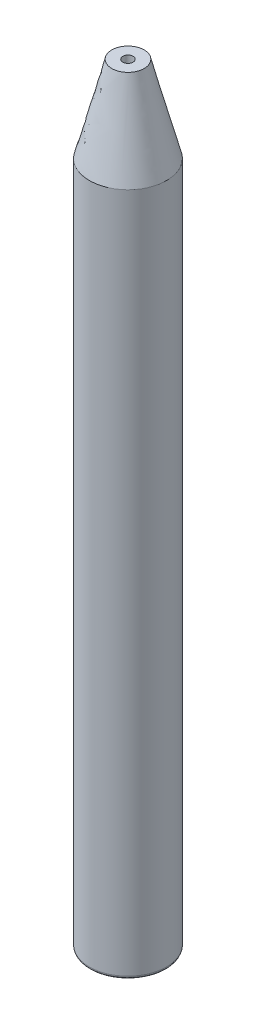
ISO-10303-21;
HEADER;
FILE_DESCRIPTION(('STEP AP214'),'2;1');
FILE_NAME('part.step','',(''),(''),'','','');
FILE_SCHEMA(('AUTOMOTIVE_DESIGN { 1 0 10303 214 1 1 1 1 }'));
ENDSEC;
DATA;
#1=APPLICATION_CONTEXT('core data for automotive mechanical design processes');
#2=APPLICATION_PROTOCOL_DEFINITION('international standard','automotive_design',2000,#1);
#3=PRODUCT_CONTEXT('',#1,'mechanical');
#4=PRODUCT('Part','Part','',(#3));
#5=PRODUCT_RELATED_PRODUCT_CATEGORY('part','',(#4));
#6=PRODUCT_DEFINITION_FORMATION('','',#4);
#7=PRODUCT_DEFINITION_CONTEXT('part definition',#1,'design');
#8=PRODUCT_DEFINITION('design','',#6,#7);
#9=PRODUCT_DEFINITION_SHAPE('','',#8);
#10=(LENGTH_UNIT() NAMED_UNIT(*) SI_UNIT(.MILLI.,.METRE.));
#11=(NAMED_UNIT(*) PLANE_ANGLE_UNIT() SI_UNIT($,.RADIAN.));
#12=(NAMED_UNIT(*) SI_UNIT($,.STERADIAN.) SOLID_ANGLE_UNIT());
#13=UNCERTAINTY_MEASURE_WITH_UNIT(LENGTH_MEASURE(1.E-05),#10,'distance_accuracy_value','');
#14=(GEOMETRIC_REPRESENTATION_CONTEXT(3) GLOBAL_UNCERTAINTY_ASSIGNED_CONTEXT((#13)) GLOBAL_UNIT_ASSIGNED_CONTEXT((#10,
#11,#12)) REPRESENTATION_CONTEXT('',''));
#15=CARTESIAN_POINT('',(0.,0.,0.));
#16=DIRECTION('',(0.,0.,1.));
#17=DIRECTION('',(1.,0.,0.));
#18=AXIS2_PLACEMENT_3D('',#15,#16,#17);
#19=CARTESIAN_POINT('',(0.,67.7,0.));
#20=DIRECTION('',(0.,-1.,0.));
#21=DIRECTION('',(0.,0.,-1.));
#22=AXIS2_PLACEMENT_3D('',#19,#20,#21);
#23=CYLINDRICAL_SURFACE('',#22,3.81);
#24=CARTESIAN_POINT('',(0.,0.299999999999995,0.));
#25=DIRECTION('',(0.,1.,0.));
#26=DIRECTION('',(0.,0.,1.));
#27=AXIS2_PLACEMENT_3D('',#24,#25,#26);
#28=CIRCLE('',#27,3.81);
#29=CARTESIAN_POINT('',(0.,0.299999999999995,3.81));
#30=VERTEX_POINT('',#29);
#31=EDGE_CURVE('E41',#30,#30,#28,.T.);
#32=ORIENTED_EDGE('',*,*,#31,.T.);
#33=EDGE_LOOP('',(#32));
#34=FACE_BOUND('',#33,.T.);
#35=CARTESIAN_POINT('',(0.,67.7,0.));
#36=DIRECTION('',(0.,-1.,0.));
#37=DIRECTION('',(0.,0.,-1.));
#38=AXIS2_PLACEMENT_3D('',#35,#36,#37);
#39=CIRCLE('',#38,3.81);
#40=CARTESIAN_POINT('',(2.3181147054244,67.7,3.02364750136241));
#41=VERTEX_POINT('',#40);
#42=EDGE_CURVE('E45',#41,#41,#39,.F.);
#43=ORIENTED_EDGE('',*,*,#42,.F.);
#44=EDGE_LOOP('',(#43));
#45=FACE_BOUND('',#44,.T.);
#46=ADVANCED_FACE('F34',(#34,#45),#23,.T.);
#47=CARTESIAN_POINT('',(0.,0.,0.));
#48=DIRECTION('',(0.,1.,0.));
#49=DIRECTION('',(0.,0.,1.));
#50=AXIS2_PLACEMENT_3D('',#47,#48,#49);
#51=PLANE('',#50);
#52=CARTESIAN_POINT('',(0.,0.,0.));
#53=DIRECTION('',(0.,1.,0.));
#54=DIRECTION('',(0.,0.,1.));
#55=AXIS2_PLACEMENT_3D('',#52,#53,#54);
#56=CIRCLE('',#55,3.51);
#57=CARTESIAN_POINT('',(0.,0.,3.51));
#58=VERTEX_POINT('',#57);
#59=EDGE_CURVE('E11',#58,#58,#56,.F.);
#60=ORIENTED_EDGE('',*,*,#59,.T.);
#61=EDGE_LOOP('',(#60));
#62=FACE_BOUND('',#61,.T.);
#63=CARTESIAN_POINT('',(0.,0.,0.));
#64=DIRECTION('',(0.,-1.,0.));
#65=DIRECTION('',(0.,0.,-1.));
#66=AXIS2_PLACEMENT_3D('',#63,#64,#65);
#67=CIRCLE('',#66,2.61);
#68=CARTESIAN_POINT('',(0.,0.,-2.61));
#69=VERTEX_POINT('',#68);
#70=EDGE_CURVE('E56',#69,#69,#67,.T.);
#71=ORIENTED_EDGE('',*,*,#70,.F.);
#72=EDGE_LOOP('',(#71));
#73=FACE_BOUND('',#72,.T.);
#74=ADVANCED_FACE('F79',(#62,#73),#51,.F.);
#75=CARTESIAN_POINT('',(0.,76.2,0.));
#76=DIRECTION('',(0.,1.,0.));
#77=DIRECTION('',(0.,0.,1.));
#78=AXIS2_PLACEMENT_3D('',#75,#76,#77);
#79=PLANE('',#78);
#80=CARTESIAN_POINT('',(0.,76.2,0.));
#81=DIRECTION('',(0.,1.,0.));
#82=DIRECTION('',(0.,0.,1.));
#83=AXIS2_PLACEMENT_3D('',#80,#81,#82);
#84=CIRCLE('',#83,0.508);
#85=CARTESIAN_POINT('',(0.,76.2,0.508));
#86=VERTEX_POINT('',#85);
#87=EDGE_CURVE('E55',#86,#86,#84,.T.);
#88=ORIENTED_EDGE('',*,*,#87,.F.);
#89=EDGE_LOOP('',(#88));
#90=FACE_BOUND('',#89,.T.);
#91=CARTESIAN_POINT('',(0.,76.2,0.));
#92=DIRECTION('',(0.,1.,0.));
#93=DIRECTION('',(0.,0.,1.));
#94=AXIS2_PLACEMENT_3D('',#91,#92,#93);
#95=CIRCLE('',#94,1.6);
#96=CARTESIAN_POINT('',(1.21597055390655,76.2,1.03991134816012));
#97=VERTEX_POINT('',#96);
#98=EDGE_CURVE('E49',#97,#97,#95,.T.);
#99=ORIENTED_EDGE('',*,*,#98,.T.);
#100=EDGE_LOOP('',(#99));
#101=FACE_BOUND('',#100,.T.);
#102=ADVANCED_FACE('F68',(#90,#101),#79,.T.);
#103=CARTESIAN_POINT('',(1.21597055390655,76.2,1.03991134816012));
#104=CARTESIAN_POINT('',(2.3181147054244,67.7,3.02364750136241));
#105=CARTESIAN_POINT('',(-0.863852142413691,76.2,3.47185245597322));
#106=CARTESIAN_POINT('',(-3.72918029730043,67.7,7.65987691221121));
#107=CARTESIAN_POINT('',(-3.29579325022679,76.2,1.39202975965298));
#108=CARTESIAN_POINT('',(-8.36540970814922,67.7,1.61258190948638));
#109=CARTESIAN_POINT('',(-1.21597055390655,76.2,-1.03991134816012));
#110=CARTESIAN_POINT('',(-2.3181147054244,67.7,-3.02364750136241));
#111=CARTESIAN_POINT('',(0.863852142413692,76.2,-3.47185245597322));
#112=CARTESIAN_POINT('',(3.72918029730043,67.7,-7.65987691221121));
#113=CARTESIAN_POINT('',(3.29579325022679,76.2,-1.39202975965298));
#114=CARTESIAN_POINT('',(8.36540970814922,67.7,-1.61258190948638));
#115=CARTESIAN_POINT('',(1.21597055390655,76.2,1.03991134816012));
#116=CARTESIAN_POINT('',(2.3181147054244,67.7,3.02364750136241));
#117=(BOUNDED_SURFACE() B_SPLINE_SURFACE(3,1,((#103,#104),(#105,#106),(#107,#108),(#109,#110),
(#111,#112),(#113,#114),(#115,#116)),.UNSPECIFIED.,.T.,.F.,.F.) B_SPLINE_SURFACE_WITH_KNOTS((4,
3,4),(2,2),(0.,0.5,1.),(0.,1.),
.UNSPECIFIED.) GEOMETRIC_REPRESENTATION_ITEM() RATIONAL_B_SPLINE_SURFACE(((1.,1.),
(0.333333333333333,0.333333333333333),(0.333333333333333,0.333333333333333),(1.,1.),
(0.333333333333333,0.333333333333333),(0.333333333333333,0.333333333333333),(1.,1.))) REPRESENTATION_ITEM('') SURFACE());
#118=CARTESIAN_POINT('',(1.21597055390655,76.2,1.03991134816012));
#119=CARTESIAN_POINT('',(1.22745122215153,76.1114583333333,1.06057526642264));
#120=CARTESIAN_POINT('',(1.2389318903965,76.0229166666667,1.08123918468517));
#121=CARTESIAN_POINT('',(1.26189322688646,75.8458333333333,1.12256702121022));
#122=CARTESIAN_POINT('',(1.27337389513144,75.7572916666667,1.14323093947274));
#123=CARTESIAN_POINT('',(1.29633523162139,75.5802083333333,1.18455877599779));
#124=CARTESIAN_POINT('',(1.30781589986637,75.4916666666667,1.20522269426031));
#125=CARTESIAN_POINT('',(1.33077723635633,75.3145833333333,1.24655053078536));
#126=CARTESIAN_POINT('',(1.3422579046013,75.2260416666667,1.26721444904788));
#127=CARTESIAN_POINT('',(1.36521924109126,75.0489583333333,1.30854228557293));
#128=CARTESIAN_POINT('',(1.37669990933624,74.9604166666667,1.32920620383545));
#129=CARTESIAN_POINT('',(1.39966124582619,74.7833333333333,1.3705340403605));
#130=CARTESIAN_POINT('',(1.41114191407117,74.6947916666667,1.39119795862303));
#131=CARTESIAN_POINT('',(1.43410325056112,74.5177083333333,1.43252579514807));
#132=CARTESIAN_POINT('',(1.4455839188061,74.4291666666667,1.4531897134106));
#133=CARTESIAN_POINT('',(1.46854525529606,74.2520833333333,1.49451754993565));
#134=CARTESIAN_POINT('',(1.48002592354103,74.1635416666667,1.51518146819817));
#135=CARTESIAN_POINT('',(1.50298726003099,73.9864583333333,1.55650930472322));
#136=CARTESIAN_POINT('',(1.51446792827597,73.8979166666667,1.57717322298574));
#137=CARTESIAN_POINT('',(1.53742926476592,73.7208333333333,1.61850105951079));
#138=CARTESIAN_POINT('',(1.5489099330109,73.6322916666667,1.63916497777331));
#139=CARTESIAN_POINT('',(1.57187126950085,73.4552083333333,1.68049281429836));
#140=CARTESIAN_POINT('',(1.58335193774583,73.3666666666667,1.70115673256088));
#141=CARTESIAN_POINT('',(1.60631327423579,73.1895833333333,1.74248456908593));
#142=CARTESIAN_POINT('',(1.61779394248077,73.1010416666667,1.76314848734846));
#143=CARTESIAN_POINT('',(1.64075527897072,72.9239583333333,1.80447632387351));
#144=CARTESIAN_POINT('',(1.6522359472157,72.8354166666667,1.82514024213603));
#145=CARTESIAN_POINT('',(1.67519728370565,72.6583333333333,1.86646807866108));
#146=CARTESIAN_POINT('',(1.68667795195063,72.5697916666667,1.8871319969236));
#147=CARTESIAN_POINT('',(1.70963928844059,72.3927083333333,1.92845983344865));
#148=CARTESIAN_POINT('',(1.72111995668556,72.3041666666667,1.94912375171117));
#149=CARTESIAN_POINT('',(1.74408129317552,72.1270833333333,1.99045158823622));
#150=CARTESIAN_POINT('',(1.7555619614205,72.0385416666667,2.01111550649874));
#151=CARTESIAN_POINT('',(1.77852329791045,71.8614583333333,2.05244334302379));
#152=CARTESIAN_POINT('',(1.79000396615543,71.7729166666667,2.07310726128631));
#153=CARTESIAN_POINT('',(1.81296530264538,71.5958333333333,2.11443509781136));
#154=CARTESIAN_POINT('',(1.82444597089036,71.5072916666667,2.13509901607389));
#155=CARTESIAN_POINT('',(1.84740730738032,71.3302083333333,2.17642685259894));
#156=CARTESIAN_POINT('',(1.85888797562529,71.2416666666667,2.19709077086146));
#157=CARTESIAN_POINT('',(1.88184931211525,71.0645833333333,2.23841860738651));
#158=CARTESIAN_POINT('',(1.89332998036023,70.9760416666667,2.25908252564903));
#159=CARTESIAN_POINT('',(1.91629131685018,70.7989583333333,2.30041036217408));
#160=CARTESIAN_POINT('',(1.92777198509516,70.7104166666667,2.3210742804366));
#161=CARTESIAN_POINT('',(1.95073332158512,70.5333333333333,2.36240211696165));
#162=CARTESIAN_POINT('',(1.96221398983009,70.4447916666667,2.38306603522417));
#163=CARTESIAN_POINT('',(1.98517532632005,70.2677083333333,2.42439387174922));
#164=CARTESIAN_POINT('',(1.99665599456503,70.1791666666667,2.44505779001175));
#165=CARTESIAN_POINT('',(2.01961733105498,70.0020833333333,2.48638562653679));
#166=CARTESIAN_POINT('',(2.03109799929996,69.9135416666667,2.50704954479932));
#167=CARTESIAN_POINT('',(2.05405933578991,69.7364583333333,2.54837738132436));
#168=CARTESIAN_POINT('',(2.06554000403489,69.6479166666667,2.56904129958689));
#169=CARTESIAN_POINT('',(2.08850134052485,69.4708333333333,2.61036913611194));
#170=CARTESIAN_POINT('',(2.09998200876982,69.3822916666667,2.63103305437446));
#171=CARTESIAN_POINT('',(2.12294334525978,69.2052083333333,2.67236089089951));
#172=CARTESIAN_POINT('',(2.13442401350476,69.1166666666667,2.69302480916203));
#173=CARTESIAN_POINT('',(2.15738534999471,68.9395833333333,2.73435264568708));
#174=CARTESIAN_POINT('',(2.16886601823969,68.8510416666667,2.7550165639496));
#175=CARTESIAN_POINT('',(2.19182735472964,68.6739583333333,2.79634440047465));
#176=CARTESIAN_POINT('',(2.20330802297462,68.5854166666667,2.81700831873718));
#177=CARTESIAN_POINT('',(2.22626935946458,68.4083333333333,2.85833615526222));
#178=CARTESIAN_POINT('',(2.23775002770955,68.3197916666667,2.87900007352475));
#179=CARTESIAN_POINT('',(2.26071136419951,68.1427083333333,2.92032791004979));
#180=CARTESIAN_POINT('',(2.27219203244449,68.0541666666667,2.94099182831232));
#181=CARTESIAN_POINT('',(2.29515336893444,67.8770833333333,2.98231966483737));
#182=CARTESIAN_POINT('',(2.30663403717942,67.7885416666667,3.00298358309989));
#183=CARTESIAN_POINT('',(2.3181147054244,67.7,3.02364750136241));
#184=B_SPLINE_CURVE_WITH_KNOTS('',3,(#118,#119,#120,#121,#122,#123,#124,#125,#126,#127,#128,
#129,#130,#131,#132,#133,#134,#135,#136,#137,#138,#139,#140,#141,#142,#143,#144,#145,#146,#147,
#148,#149,#150,#151,#152,#153,#154,#155,#156,#157,#158,#159,#160,#161,#162,#163,#164,#165,#166,
#167,#168,#169,#170,#171,#172,#173,#174,#175,#176,#177,#178,#179,#180,#181,#182,#183),
.UNSPECIFIED.,.F.,.F.,(4,2,2,2,2,2,2,2,2,2,2,2,2,2,2,2,2,2,2,2,2,2,2,2,2,2,2,2,2,2,2,2,4),(0.,
0.274928845297845,0.549857690595677,0.824786535893522,1.09971538119137,1.37464422648921,
1.64957307178704,1.92450191708489,2.19943076238272,2.47435960768055,2.7492884529784,
3.02421729827624,3.29914614357407,3.57407498887192,3.84900383416976,4.1239326794676,
4.39886152476544,4.67379037006329,4.94871921536112,5.22364806065896,5.49857690595681,
5.77350575125464,6.04843459655249,6.32336344185032,6.59829228714816,6.87322113244601,
7.14814997774384,7.42307882304168,7.69800766833952,7.97293651363736,8.24786535893521,
8.52279420423304,8.79772304953088),.UNSPECIFIED.);
#185=EDGE_CURVE('BSEAM78',#97,#41,#184,.T.);
#186=ORIENTED_EDGE('',*,*,#98,.F.);
#187=ORIENTED_EDGE('',*,*,#42,.T.);
#188=ORIENTED_EDGE('',*,*,#185,.T.);
#189=ORIENTED_EDGE('',*,*,#185,.F.);
#190=EDGE_LOOP('',(#186,#188,#187,#189));
#191=FACE_BOUND('',#190,.T.);
#192=ADVANCED_FACE('F78',(#191),#117,.T.);
#193=CARTESIAN_POINT('',(0.,0.,0.));
#194=DIRECTION('',(0.,1.,0.));
#195=DIRECTION('',(0.,0.,1.));
#196=AXIS2_PLACEMENT_3D('',#193,#194,#195);
#197=CYLINDRICAL_SURFACE('',#196,0.508);
#198=CARTESIAN_POINT('',(0.,5.99230968493152,0.));
#199=DIRECTION('',(0.,-1.,0.));
#200=DIRECTION('',(0.,0.,-1.));
#201=AXIS2_PLACEMENT_3D('',#198,#199,#200);
#202=CIRCLE('',#201,0.508);
#203=CARTESIAN_POINT('',(0.,5.99230968493152,-0.508));
#204=VERTEX_POINT('',#203);
#205=EDGE_CURVE('E52',#204,#204,#202,.T.);
#206=ORIENTED_EDGE('',*,*,#205,.T.);
#207=EDGE_LOOP('',(#206));
#208=FACE_BOUND('',#207,.T.);
#209=ORIENTED_EDGE('',*,*,#87,.T.);
#210=EDGE_LOOP('',(#209));
#211=FACE_BOUND('',#210,.T.);
#212=ADVANCED_FACE('F81',(#208,#211),#197,.F.);
#213=CARTESIAN_POINT('',(0.,0.,0.));
#214=DIRECTION('',(0.,-1.,0.));
#215=DIRECTION('',(0.,0.,-1.));
#216=AXIS2_PLACEMENT_3D('',#213,#214,#215);
#217=CONICAL_SURFACE('',#216,2.61,0.337372144410505);
#218=CARTESIAN_POINT('',(0.,0.,-2.61));
#219=CARTESIAN_POINT('',(0.,0.0624198925513699,-2.58810416666667));
#220=CARTESIAN_POINT('',(0.,0.12483978510274,-2.56620833333333));
#221=CARTESIAN_POINT('',(0.,0.24967957020548,-2.52241666666667));
#222=CARTESIAN_POINT('',(0.,0.31209946275685,-2.50052083333333));
#223=CARTESIAN_POINT('',(0.,0.43693924785959,-2.45672916666667));
#224=CARTESIAN_POINT('',(0.,0.49935914041096,-2.43483333333333));
#225=CARTESIAN_POINT('',(0.,0.6241989255137,-2.39104166666667));
#226=CARTESIAN_POINT('',(0.,0.68661881806507,-2.36914583333333));
#227=CARTESIAN_POINT('',(0.,0.81145860316781,-2.32535416666667));
#228=CARTESIAN_POINT('',(0.,0.87387849571918,-2.30345833333333));
#229=CARTESIAN_POINT('',(0.,0.998718280821919,-2.25966666666667));
#230=CARTESIAN_POINT('',(0.,1.06113817337329,-2.23777083333333));
#231=CARTESIAN_POINT('',(0.,1.18597795847603,-2.19397916666667));
#232=CARTESIAN_POINT('',(0.,1.2483978510274,-2.17208333333333));
#233=CARTESIAN_POINT('',(0.,1.37323763613014,-2.12829166666667));
#234=CARTESIAN_POINT('',(0.,1.43565752868151,-2.10639583333333));
#235=CARTESIAN_POINT('',(0.,1.56049731378425,-2.06260416666667));
#236=CARTESIAN_POINT('',(0.,1.62291720633562,-2.04070833333333));
#237=CARTESIAN_POINT('',(0.,1.74775699143836,-1.99691666666667));
#238=CARTESIAN_POINT('',(0.,1.81017688398973,-1.97502083333333));
#239=CARTESIAN_POINT('',(0.,1.93501666909247,-1.93122916666667));
#240=CARTESIAN_POINT('',(0.,1.99743656164384,-1.90933333333333));
#241=CARTESIAN_POINT('',(0.,2.12227634674658,-1.86554166666667));
#242=CARTESIAN_POINT('',(0.,2.18469623929795,-1.84364583333333));
#243=CARTESIAN_POINT('',(0.,2.30953602440069,-1.79985416666667));
#244=CARTESIAN_POINT('',(0.,2.37195591695206,-1.77795833333333));
#245=CARTESIAN_POINT('',(0.,2.4967957020548,-1.73416666666667));
#246=CARTESIAN_POINT('',(0.,2.55921559460617,-1.71227083333333));
#247=CARTESIAN_POINT('',(0.,2.68405537970891,-1.66847916666667));
#248=CARTESIAN_POINT('',(0.,2.74647527226028,-1.64658333333333));
#249=CARTESIAN_POINT('',(0.,2.87131505736302,-1.60279166666667));
#250=CARTESIAN_POINT('',(0.,2.93373494991439,-1.58089583333333));
#251=CARTESIAN_POINT('',(0.,3.05857473501713,-1.53710416666667));
#252=CARTESIAN_POINT('',(0.,3.1209946275685,-1.51520833333333));
#253=CARTESIAN_POINT('',(0.,3.24583441267124,-1.47141666666667));
#254=CARTESIAN_POINT('',(0.,3.30825430522261,-1.44952083333333));
#255=CARTESIAN_POINT('',(0.,3.43309409032535,-1.40572916666667));
#256=CARTESIAN_POINT('',(0.,3.49551398287672,-1.38383333333333));
#257=CARTESIAN_POINT('',(0.,3.62035376797946,-1.34004166666667));
#258=CARTESIAN_POINT('',(0.,3.68277366053083,-1.31814583333333));
#259=CARTESIAN_POINT('',(0.,3.80761344563357,-1.27435416666667));
#260=CARTESIAN_POINT('',(0.,3.87003333818494,-1.25245833333333));
#261=CARTESIAN_POINT('',(0.,3.99487312328768,-1.20866666666667));
#262=CARTESIAN_POINT('',(0.,4.05729301583905,-1.18677083333333));
#263=CARTESIAN_POINT('',(0.,4.18213280094179,-1.14297916666667));
#264=CARTESIAN_POINT('',(0.,4.24455269349316,-1.12108333333333));
#265=CARTESIAN_POINT('',(0.,4.3693924785959,-1.07729166666667));
#266=CARTESIAN_POINT('',(0.,4.43181237114727,-1.05539583333333));
#267=CARTESIAN_POINT('',(0.,4.55665215625001,-1.01160416666667));
#268=CARTESIAN_POINT('',(0.,4.61907204880138,-0.989708333333333));
#269=CARTESIAN_POINT('',(0.,4.74391183390412,-0.945916666666667));
#270=CARTESIAN_POINT('',(0.,4.80633172645549,-0.924020833333333));
#271=CARTESIAN_POINT('',(0.,4.93117151155823,-0.880229166666667));
#272=CARTESIAN_POINT('',(0.,4.9935914041096,-0.858333333333334));
#273=CARTESIAN_POINT('',(0.,5.11843118921234,-0.814541666666667));
#274=CARTESIAN_POINT('',(0.,5.18085108176371,-0.792645833333333));
#275=CARTESIAN_POINT('',(0.,5.30569086686645,-0.748854166666667));
#276=CARTESIAN_POINT('',(0.,5.36811075941782,-0.726958333333333));
#277=CARTESIAN_POINT('',(0.,5.49295054452056,-0.683166666666667));
#278=CARTESIAN_POINT('',(0.,5.55537043707193,-0.661270833333333));
#279=CARTESIAN_POINT('',(0.,5.68021022217467,-0.617479166666666));
#280=CARTESIAN_POINT('',(0.,5.74263011472604,-0.595583333333333));
#281=CARTESIAN_POINT('',(0.,5.86746989982878,-0.551791666666667));
#282=CARTESIAN_POINT('',(0.,5.92988979238015,-0.529895833333333));
#283=CARTESIAN_POINT('',(0.,5.99230968493152,-0.508));
#284=B_SPLINE_CURVE_WITH_KNOTS('',3,(#218,#219,#220,#221,#222,#223,#224,#225,#226,#227,#228,
#229,#230,#231,#232,#233,#234,#235,#236,#237,#238,#239,#240,#241,#242,#243,#244,#245,#246,#247,
#248,#249,#250,#251,#252,#253,#254,#255,#256,#257,#258,#259,#260,#261,#262,#263,#264,#265,#266,
#267,#268,#269,#270,#271,#272,#273,#274,#275,#276,#277,#278,#279,#280,#281,#282,#283),
.UNSPECIFIED.,.F.,.F.,(4,2,2,2,2,2,2,2,2,2,2,2,2,2,2,2,2,2,2,2,2,2,2,2,2,2,2,2,2,2,2,2,4),(0.,
0.198446553337092,0.396893106674183,0.595339660011275,0.793786213348366,0.992232766685458,
1.19067932002255,1.38912587335964,1.58757242669673,1.78601898003382,1.98446553337092,
2.18291208670801,2.3813586400451,2.57980519338219,2.77825174671928,2.97669830005637,
3.17514485339347,3.37359140673056,3.57203796006765,3.77048451340474,3.96893106674183,
4.16737762007892,4.36582417341602,4.56427072675311,4.7627172800902,4.96116383342729,
5.15961038676438,5.35805694010147,5.55650349343857,5.75495004677566,5.95339660011275,
6.15184315344984,6.35028970678693),.UNSPECIFIED.);
#285=EDGE_CURVE('BSEAM109',#69,#204,#284,.T.);
#286=ORIENTED_EDGE('',*,*,#70,.T.);
#287=ORIENTED_EDGE('',*,*,#205,.F.);
#288=ORIENTED_EDGE('',*,*,#285,.T.);
#289=ORIENTED_EDGE('',*,*,#285,.F.);
#290=EDGE_LOOP('',(#286,#288,#287,#289));
#291=FACE_BOUND('',#290,.T.);
#292=ADVANCED_FACE('F109',(#291),#217,.F.);
#293=CARTESIAN_POINT('',(0.,0.299999999999995,0.));
#294=DIRECTION('',(0.,1.,0.));
#295=DIRECTION('',(0.,0.,1.));
#296=AXIS2_PLACEMENT_3D('',#293,#294,#295);
#297=TOROIDAL_SURFACE('',#296,3.51,0.3);
#298=ORIENTED_EDGE('',*,*,#59,.F.);
#299=EDGE_LOOP('',(#298));
#300=FACE_BOUND('',#299,.T.);
#301=ORIENTED_EDGE('',*,*,#31,.F.);
#302=EDGE_LOOP('',(#301));
#303=FACE_BOUND('',#302,.T.);
#304=ADVANCED_FACE('F36',(#300,#303),#297,.T.);
#305=CLOSED_SHELL('',(#46,#74,#102,#192,#212,#292,#304));
#306=MANIFOLD_SOLID_BREP('B2',#305);
#307=ADVANCED_BREP_SHAPE_REPRESENTATION('',(#18,#306),#14);
#308=SHAPE_DEFINITION_REPRESENTATION(#9,#307);
ENDSEC;
END-ISO-10303-21;
